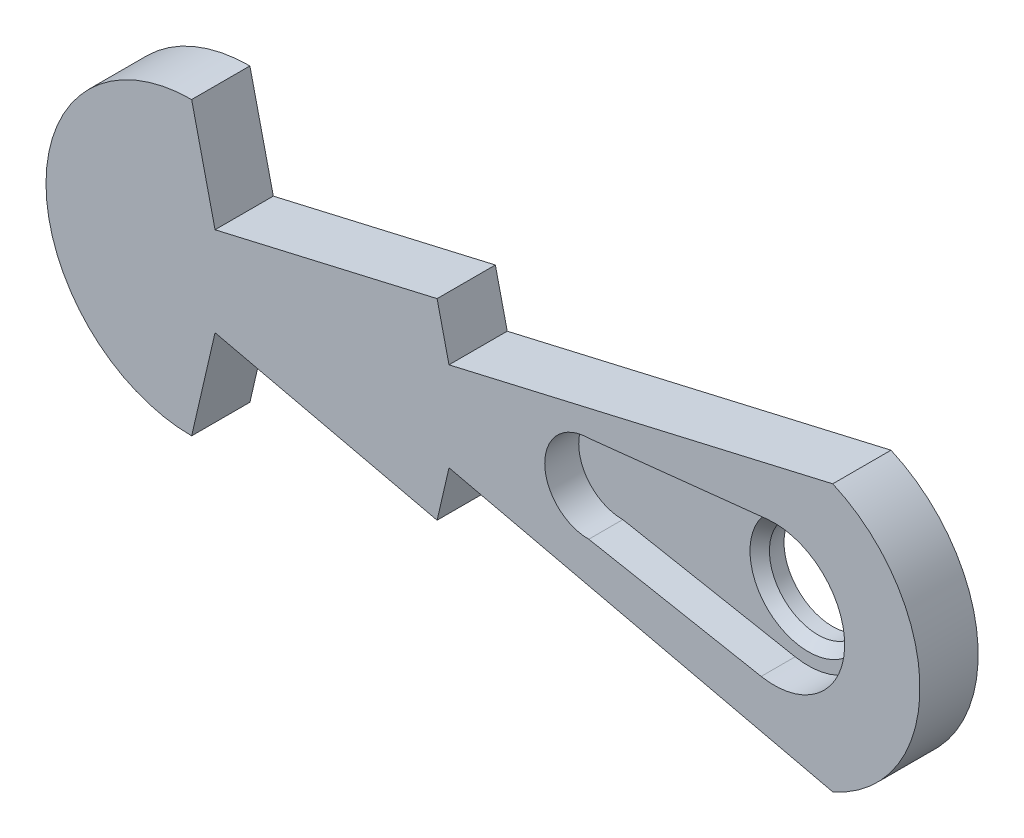
ISO-10303-21;
HEADER;
FILE_DESCRIPTION(('STEP AP214'),'2;1');
FILE_NAME('part.step','',(''),(''),'','','');
FILE_SCHEMA(('AUTOMOTIVE_DESIGN { 1 0 10303 214 1 1 1 1 }'));
ENDSEC;
DATA;
#1=APPLICATION_CONTEXT('core data for automotive mechanical design processes');
#2=APPLICATION_PROTOCOL_DEFINITION('international standard','automotive_design',2000,#1);
#3=PRODUCT_CONTEXT('',#1,'mechanical');
#4=PRODUCT('Part','Part','',(#3));
#5=PRODUCT_RELATED_PRODUCT_CATEGORY('part','',(#4));
#6=PRODUCT_DEFINITION_FORMATION('','',#4);
#7=PRODUCT_DEFINITION_CONTEXT('part definition',#1,'design');
#8=PRODUCT_DEFINITION('design','',#6,#7);
#9=PRODUCT_DEFINITION_SHAPE('','',#8);
#10=(LENGTH_UNIT() NAMED_UNIT(*) SI_UNIT(.MILLI.,.METRE.));
#11=(NAMED_UNIT(*) PLANE_ANGLE_UNIT() SI_UNIT($,.RADIAN.));
#12=(NAMED_UNIT(*) SI_UNIT($,.STERADIAN.) SOLID_ANGLE_UNIT());
#13=UNCERTAINTY_MEASURE_WITH_UNIT(LENGTH_MEASURE(1.E-05),#10,'distance_accuracy_value','');
#14=(GEOMETRIC_REPRESENTATION_CONTEXT(3) GLOBAL_UNCERTAINTY_ASSIGNED_CONTEXT((#13)) GLOBAL_UNIT_ASSIGNED_CONTEXT((#10,
#11,#12)) REPRESENTATION_CONTEXT('',''));
#15=CARTESIAN_POINT('',(0.,0.,0.));
#16=DIRECTION('',(0.,0.,1.));
#17=DIRECTION('',(1.,0.,0.));
#18=AXIS2_PLACEMENT_3D('',#15,#16,#17);
#19=CARTESIAN_POINT('',(24.346962962963,0.,0.));
#20=DIRECTION('',(0.,0.,1.));
#21=DIRECTION('',(1.,0.,0.));
#22=AXIS2_PLACEMENT_3D('',#19,#20,#21);
#23=CYLINDRICAL_SURFACE('',#22,5.);
#24=CARTESIAN_POINT('',(24.346962962963,0.,-0.500000000000015));
#25=DIRECTION('',(0.,0.,1.));
#26=DIRECTION('',(1.,0.,0.));
#27=AXIS2_PLACEMENT_3D('',#24,#25,#26);
#28=CIRCLE('',#27,5.);
#29=CARTESIAN_POINT('',(29.346962962963,0.,-0.500000000000015));
#30=VERTEX_POINT('',#29);
#31=EDGE_CURVE('E12',#30,#30,#28,.T.);
#32=ORIENTED_EDGE('',*,*,#31,.T.);
#33=EDGE_LOOP('',(#32));
#34=FACE_BOUND('',#33,.T.);
#35=CARTESIAN_POINT('',(24.346962962963,0.,-2.));
#36=DIRECTION('',(0.,0.,-1.));
#37=DIRECTION('',(-1.,0.,0.));
#38=AXIS2_PLACEMENT_3D('',#35,#36,#37);
#39=CIRCLE('',#38,5.);
#40=CARTESIAN_POINT('',(19.346962962963,0.,-2.));
#41=VERTEX_POINT('',#40);
#42=EDGE_CURVE('E566',#41,#41,#39,.T.);
#43=ORIENTED_EDGE('',*,*,#42,.T.);
#44=EDGE_LOOP('',(#43));
#45=FACE_BOUND('',#44,.T.);
#46=ADVANCED_FACE('F105',(#34,#45),#23,.F.);
#47=CARTESIAN_POINT('',(-35.653037037037,0.,4.));
#48=DIRECTION('',(0.,0.,1.));
#49=DIRECTION('',(1.,0.,0.));
#50=AXIS2_PLACEMENT_3D('',#47,#48,#49);
#51=PLANE('',#50);
#52=DIRECTION('',(-0.994296405562891,-0.106652041165249,0.));
#53=VECTOR('',#52,1.);
#54=CARTESIAN_POINT('',(-0.49628892421255,4.6268059014514,4.));
#55=LINE('',#54,#53);
#56=CARTESIAN_POINT('',(23.5737356645149,7.20864894033096,4.));
#57=VERTEX_POINT('',#56);
#58=CARTESIAN_POINT('',(5.1730344718707,5.23491924555615,4.));
#59=VERTEX_POINT('',#58);
#60=EDGE_CURVE('E120',#57,#59,#55,.T.);
#61=ORIENTED_EDGE('',*,*,#60,.F.);
#62=CARTESIAN_POINT('',(24.346962962963,0.,4.));
#63=DIRECTION('',(0.,0.,1.));
#64=DIRECTION('',(1.,0.,0.));
#65=AXIS2_PLACEMENT_3D('',#62,#63,#64);
#66=CIRCLE('',#65,7.25);
#67=CARTESIAN_POINT('',(22.9992121097158,-7.1236274213052,4.));
#68=VERTEX_POINT('',#67);
#69=EDGE_CURVE('E306',#68,#57,#66,.T.);
#70=ORIENTED_EDGE('',*,*,#69,.F.);
#71=DIRECTION('',(-0.982569299490373,0.185896669413408,0.));
#72=VECTOR('',#71,1.);
#73=CARTESIAN_POINT('',(-0.506378935001769,-2.6764997835162,4.));
#74=LINE('',#73,#72);
#75=CARTESIAN_POINT('',(5.24583251092057,-3.76478632993411,4.));
#76=VERTEX_POINT('',#75);
#77=EDGE_CURVE('E320',#68,#76,#74,.T.);
#78=ORIENTED_EDGE('',*,*,#77,.T.);
#79=CARTESIAN_POINT('',(5.20943349139563,0.735066457811019,4.));
#80=DIRECTION('',(0.,0.,1.));
#81=DIRECTION('',(1.,0.,0.));
#82=AXIS2_PLACEMENT_3D('',#79,#80,#81);
#83=CIRCLE('',#82,4.5);
#84=EDGE_CURVE('E317',#59,#76,#83,.T.);
#85=ORIENTED_EDGE('',*,*,#84,.F.);
#86=EDGE_LOOP('',(#61,#70,#78,#85));
#87=FACE_BOUND('',#86,.T.);
#88=CARTESIAN_POINT('',(-35.653037037037,0.,4.));
#89=DIRECTION('',(0.,0.,1.));
#90=DIRECTION('',(1.,0.,0.));
#91=AXIS2_PLACEMENT_3D('',#88,#89,#90);
#92=CIRCLE('',#91,15.);
#93=CARTESIAN_POINT('',(-35.653037037037,15.,4.));
#94=VERTEX_POINT('',#93);
#95=CARTESIAN_POINT('',(-35.653037037037,-15.,4.));
#96=VERTEX_POINT('',#95);
#97=EDGE_CURVE('E176',#94,#96,#92,.T.);
#98=ORIENTED_EDGE('',*,*,#97,.T.);
#99=DIRECTION('',(0.225493963672829,0.974244564956416,0.));
#100=VECTOR('',#99,1.);
#101=CARTESIAN_POINT('',(-30.544874222306,7.06976975394667,4.));
#102=LINE('',#101,#100);
#103=CARTESIAN_POINT('',(-33.2437545519344,-4.59071751489741,4.));
#104=VERTEX_POINT('',#103);
#105=EDGE_CURVE('E163',#96,#104,#102,.T.);
#106=ORIENTED_EDGE('',*,*,#105,.T.);
#107=DIRECTION('',(0.974244564956416,-0.225493963672829,0.));
#108=VECTOR('',#107,1.);
#109=CARTESIAN_POINT('',(-2.69888032962836,-11.6604872688441,4.));
#110=LINE('',#109,#108);
#111=CARTESIAN_POINT('',(-10.3759902787571,-9.88358030497655,4.));
#112=VERTEX_POINT('',#111);
#113=EDGE_CURVE('E175',#104,#112,#110,.T.);
#114=ORIENTED_EDGE('',*,*,#113,.T.);
#115=DIRECTION('',(0.225493963672828,0.974244564956417,0.));
#116=VECTOR('',#115,1.);
#117=CARTESIAN_POINT('',(-7.67710994912871,1.77690696386752,4.));
#118=LINE('',#117,#116);
#119=CARTESIAN_POINT('',(-9.15092970090846,-4.59071751489741,4.));
#120=VERTEX_POINT('',#119);
#121=EDGE_CURVE('E208',#112,#120,#118,.T.);
#122=ORIENTED_EDGE('',*,*,#121,.T.);
#123=DIRECTION('',(0.974244564956417,-0.225493963672828,0.));
#124=VECTOR('',#123,1.);
#125=CARTESIAN_POINT('',(-1.47381975177974,-6.36762447876493,4.));
#126=LINE('',#125,#124);
#127=CARTESIAN_POINT('',(30.3694147785392,-13.7379064682019,4.));
#128=VERTEX_POINT('',#127);
#129=EDGE_CURVE('E204',#120,#128,#126,.T.);
#130=ORIENTED_EDGE('',*,*,#129,.T.);
#131=CARTESIAN_POINT('',(24.346962962963,0.,4.));
#132=DIRECTION('',(0.,0.,1.));
#133=DIRECTION('',(1.,0.,0.));
#134=AXIS2_PLACEMENT_3D('',#131,#132,#133);
#135=CIRCLE('',#134,15.);
#136=CARTESIAN_POINT('',(30.3694147785392,13.7379064682019,4.));
#137=VERTEX_POINT('',#136);
#138=EDGE_CURVE('E207',#128,#137,#135,.T.);
#139=ORIENTED_EDGE('',*,*,#138,.T.);
#140=DIRECTION('',(0.974244564956417,0.225493963672828,0.));
#141=VECTOR('',#140,1.);
#142=CARTESIAN_POINT('',(-1.47381975177974,6.36762447876493,4.));
#143=LINE('',#142,#141);
#144=CARTESIAN_POINT('',(-9.15092970090846,4.59071751489741,4.));
#145=VERTEX_POINT('',#144);
#146=EDGE_CURVE('E337',#145,#137,#143,.T.);
#147=ORIENTED_EDGE('',*,*,#146,.F.);
#148=DIRECTION('',(0.225493963672828,-0.974244564956417,0.));
#149=VECTOR('',#148,1.);
#150=CARTESIAN_POINT('',(-7.67710994912871,-1.77690696386752,4.));
#151=LINE('',#150,#149);
#152=CARTESIAN_POINT('',(-10.3759902787571,9.88358030497655,4.));
#153=VERTEX_POINT('',#152);
#154=EDGE_CURVE('E334',#153,#145,#151,.T.);
#155=ORIENTED_EDGE('',*,*,#154,.F.);
#156=DIRECTION('',(0.974244564956416,0.225493963672829,0.));
#157=VECTOR('',#156,1.);
#158=CARTESIAN_POINT('',(-2.69888032962836,11.6604872688441,4.));
#159=LINE('',#158,#157);
#160=CARTESIAN_POINT('',(-33.2437545519344,4.59071751489741,4.));
#161=VERTEX_POINT('',#160);
#162=EDGE_CURVE('E347',#161,#153,#159,.T.);
#163=ORIENTED_EDGE('',*,*,#162,.F.);
#164=DIRECTION('',(0.225493963672829,-0.974244564956416,0.));
#165=VECTOR('',#164,1.);
#166=CARTESIAN_POINT('',(-30.544874222306,-7.06976975394667,4.));
#167=LINE('',#166,#165);
#168=EDGE_CURVE('E183',#94,#161,#167,.T.);
#169=ORIENTED_EDGE('',*,*,#168,.F.);
#170=EDGE_LOOP('',(#98,#106,#114,#122,#130,#139,#147,#155,#163,#169));
#171=FACE_BOUND('',#170,.T.);
#172=ADVANCED_FACE('F180',(#87,#171),#51,.T.);
#173=CARTESIAN_POINT('',(24.346962962963,0.,4.));
#174=DIRECTION('',(0.,0.,-1.));
#175=DIRECTION('',(-1.,0.,0.));
#176=AXIS2_PLACEMENT_3D('',#173,#174,#175);
#177=CYLINDRICAL_SURFACE('',#176,15.);
#178=DIRECTION('',(0.,0.,1.));
#179=VECTOR('',#178,1.);
#180=CARTESIAN_POINT('',(30.3694147785392,-13.7379064682019,0.));
#181=LINE('',#180,#179);
#182=CARTESIAN_POINT('',(30.3694147785392,-13.7379064682019,-2.));
#183=VERTEX_POINT('',#182);
#184=EDGE_CURVE('E192',#183,#128,#181,.T.);
#185=ORIENTED_EDGE('',*,*,#184,.F.);
#186=CARTESIAN_POINT('',(24.346962962963,0.,-2.));
#187=DIRECTION('',(0.,0.,-1.));
#188=DIRECTION('',(-1.,0.,0.));
#189=AXIS2_PLACEMENT_3D('',#186,#187,#188);
#190=CIRCLE('',#189,15.);
#191=CARTESIAN_POINT('',(30.3694147785392,13.7379064682019,-2.));
#192=VERTEX_POINT('',#191);
#193=EDGE_CURVE('E295',#192,#183,#190,.T.);
#194=ORIENTED_EDGE('',*,*,#193,.F.);
#195=DIRECTION('',(0.,0.,1.));
#196=VECTOR('',#195,1.);
#197=CARTESIAN_POINT('',(30.3694147785392,13.7379064682019,0.));
#198=LINE('',#197,#196);
#199=EDGE_CURVE('E338',#192,#137,#198,.T.);
#200=ORIENTED_EDGE('',*,*,#199,.T.);
#201=ORIENTED_EDGE('',*,*,#138,.F.);
#202=EDGE_LOOP('',(#185,#194,#200,#201));
#203=FACE_BOUND('',#202,.T.);
#204=ADVANCED_FACE('F233',(#203),#177,.T.);
#205=CARTESIAN_POINT('',(-35.653037037037,0.,4.));
#206=DIRECTION('',(0.,0.,-1.));
#207=DIRECTION('',(-1.,0.,0.));
#208=AXIS2_PLACEMENT_3D('',#205,#206,#207);
#209=CYLINDRICAL_SURFACE('',#208,15.);
#210=DIRECTION('',(0.,0.,-1.));
#211=VECTOR('',#210,1.);
#212=CARTESIAN_POINT('',(-35.653037037037,15.,4.));
#213=LINE('',#212,#211);
#214=CARTESIAN_POINT('',(-35.653037037037,15.,-2.));
#215=VERTEX_POINT('',#214);
#216=EDGE_CURVE('E198',#94,#215,#213,.T.);
#217=ORIENTED_EDGE('',*,*,#216,.T.);
#218=CARTESIAN_POINT('',(-35.653037037037,0.,-2.));
#219=DIRECTION('',(0.,0.,-1.));
#220=DIRECTION('',(-1.,0.,0.));
#221=AXIS2_PLACEMENT_3D('',#218,#219,#220);
#222=CIRCLE('',#221,15.);
#223=CARTESIAN_POINT('',(-35.653037037037,-15.,-2.));
#224=VERTEX_POINT('',#223);
#225=EDGE_CURVE('E191',#224,#215,#222,.T.);
#226=ORIENTED_EDGE('',*,*,#225,.F.);
#227=DIRECTION('',(0.,0.,-1.));
#228=VECTOR('',#227,1.);
#229=CARTESIAN_POINT('',(-35.653037037037,-15.,4.));
#230=LINE('',#229,#228);
#231=EDGE_CURVE('E169',#96,#224,#230,.T.);
#232=ORIENTED_EDGE('',*,*,#231,.F.);
#233=ORIENTED_EDGE('',*,*,#97,.F.);
#234=EDGE_LOOP('',(#217,#226,#232,#233));
#235=FACE_BOUND('',#234,.T.);
#236=ADVANCED_FACE('F189',(#235),#209,.T.);
#237=CARTESIAN_POINT('',(-2.69888032962836,11.6604872688441,0.));
#238=DIRECTION('',(0.225493963672829,-0.974244564956416,0.));
#239=DIRECTION('',(0.974244564956416,0.225493963672829,0.));
#240=AXIS2_PLACEMENT_3D('',#237,#238,#239);
#241=PLANE('',#240);
#242=ORIENTED_EDGE('',*,*,#162,.T.);
#243=DIRECTION('',(0.,0.,1.));
#244=VECTOR('',#243,1.);
#245=CARTESIAN_POINT('',(-10.3759902787571,9.88358030497655,0.));
#246=LINE('',#245,#244);
#247=CARTESIAN_POINT('',(-10.3759902787571,9.88358030497655,-2.));
#248=VERTEX_POINT('',#247);
#249=EDGE_CURVE('E203',#248,#153,#246,.T.);
#250=ORIENTED_EDGE('',*,*,#249,.F.);
#251=DIRECTION('',(0.974244564956416,0.225493963672829,0.));
#252=VECTOR('',#251,1.);
#253=CARTESIAN_POINT('',(-33.2437545519344,4.59071751489741,-2.));
#254=LINE('',#253,#252);
#255=CARTESIAN_POINT('',(-33.2437545519344,4.59071751489741,-2.));
#256=VERTEX_POINT('',#255);
#257=EDGE_CURVE('E555',#256,#248,#254,.T.);
#258=ORIENTED_EDGE('',*,*,#257,.F.);
#259=DIRECTION('',(0.,0.,1.));
#260=VECTOR('',#259,1.);
#261=CARTESIAN_POINT('',(-33.2437545519344,4.59071751489741,0.));
#262=LINE('',#261,#260);
#263=EDGE_CURVE('E346',#256,#161,#262,.T.);
#264=ORIENTED_EDGE('',*,*,#263,.T.);
#265=EDGE_LOOP('',(#242,#250,#258,#264));
#266=FACE_BOUND('',#265,.T.);
#267=ADVANCED_FACE('F250',(#266),#241,.F.);
#268=CARTESIAN_POINT('',(-30.544874222306,-7.06976975394667,0.));
#269=DIRECTION('',(-0.974244564956416,-0.225493963672829,0.));
#270=DIRECTION('',(0.225493963672829,-0.974244564956416,0.));
#271=AXIS2_PLACEMENT_3D('',#268,#269,#270);
#272=PLANE('',#271);
#273=ORIENTED_EDGE('',*,*,#168,.T.);
#274=ORIENTED_EDGE('',*,*,#263,.F.);
#275=DIRECTION('',(0.225493963672829,-0.974244564956416,0.));
#276=VECTOR('',#275,1.);
#277=CARTESIAN_POINT('',(-35.653037037037,15.,-2.));
#278=LINE('',#277,#276);
#279=EDGE_CURVE('E551',#215,#256,#278,.T.);
#280=ORIENTED_EDGE('',*,*,#279,.F.);
#281=ORIENTED_EDGE('',*,*,#216,.F.);
#282=EDGE_LOOP('',(#273,#274,#280,#281));
#283=FACE_BOUND('',#282,.T.);
#284=ADVANCED_FACE('F248',(#283),#272,.F.);
#285=CARTESIAN_POINT('',(-1.47381975177974,6.36762447876493,0.));
#286=DIRECTION('',(0.225493963672828,-0.974244564956416,0.));
#287=DIRECTION('',(0.974244564956417,0.225493963672828,0.));
#288=AXIS2_PLACEMENT_3D('',#285,#286,#287);
#289=PLANE('',#288);
#290=ORIENTED_EDGE('',*,*,#146,.T.);
#291=ORIENTED_EDGE('',*,*,#199,.F.);
#292=DIRECTION('',(0.974244564956416,0.225493963672828,0.));
#293=VECTOR('',#292,1.);
#294=CARTESIAN_POINT('',(-9.15092970090846,4.59071751489741,-2.));
#295=LINE('',#294,#293);
#296=CARTESIAN_POINT('',(-9.15092970090846,4.59071751489741,-2.));
#297=VERTEX_POINT('',#296);
#298=EDGE_CURVE('E298',#297,#192,#295,.T.);
#299=ORIENTED_EDGE('',*,*,#298,.F.);
#300=DIRECTION('',(0.,0.,1.));
#301=VECTOR('',#300,1.);
#302=CARTESIAN_POINT('',(-9.15092970090846,4.59071751489741,0.));
#303=LINE('',#302,#301);
#304=EDGE_CURVE('E335',#297,#145,#303,.T.);
#305=ORIENTED_EDGE('',*,*,#304,.T.);
#306=EDGE_LOOP('',(#290,#291,#299,#305));
#307=FACE_BOUND('',#306,.T.);
#308=ADVANCED_FACE('F244',(#307),#289,.F.);
#309=CARTESIAN_POINT('',(-7.67710994912871,-1.77690696386752,0.));
#310=DIRECTION('',(-0.974244564956417,-0.225493963672828,0.));
#311=DIRECTION('',(0.225493963672828,-0.974244564956417,0.));
#312=AXIS2_PLACEMENT_3D('',#309,#310,#311);
#313=PLANE('',#312);
#314=ORIENTED_EDGE('',*,*,#154,.T.);
#315=ORIENTED_EDGE('',*,*,#304,.F.);
#316=DIRECTION('',(0.225493963672828,-0.974244564956417,0.));
#317=VECTOR('',#316,1.);
#318=CARTESIAN_POINT('',(-10.3759902787571,9.88358030497655,-2.));
#319=LINE('',#318,#317);
#320=EDGE_CURVE('E557',#248,#297,#319,.T.);
#321=ORIENTED_EDGE('',*,*,#320,.F.);
#322=ORIENTED_EDGE('',*,*,#249,.T.);
#323=EDGE_LOOP('',(#314,#315,#321,#322));
#324=FACE_BOUND('',#323,.T.);
#325=ADVANCED_FACE('F240',(#324),#313,.F.);
#326=CARTESIAN_POINT('',(-7.67710994912871,1.77690696386752,0.));
#327=DIRECTION('',(0.974244564956417,-0.225493963672828,0.));
#328=DIRECTION('',(0.225493963672828,0.974244564956417,0.));
#329=AXIS2_PLACEMENT_3D('',#326,#327,#328);
#330=PLANE('',#329);
#331=ORIENTED_EDGE('',*,*,#121,.F.);
#332=DIRECTION('',(0.,0.,1.));
#333=VECTOR('',#332,1.);
#334=CARTESIAN_POINT('',(-10.3759902787571,-9.88358030497655,0.));
#335=LINE('',#334,#333);
#336=CARTESIAN_POINT('',(-10.3759902787571,-9.88358030497655,-2.));
#337=VERTEX_POINT('',#336);
#338=EDGE_CURVE('E129',#337,#112,#335,.T.);
#339=ORIENTED_EDGE('',*,*,#338,.F.);
#340=DIRECTION('',(-0.225493963672828,-0.974244564956417,0.));
#341=VECTOR('',#340,1.);
#342=CARTESIAN_POINT('',(-9.15092970090846,-4.59071751489741,-2.));
#343=LINE('',#342,#341);
#344=CARTESIAN_POINT('',(-9.15092970090846,-4.59071751489741,-2.));
#345=VERTEX_POINT('',#344);
#346=EDGE_CURVE('E284',#345,#337,#343,.T.);
#347=ORIENTED_EDGE('',*,*,#346,.F.);
#348=DIRECTION('',(0.,0.,1.));
#349=VECTOR('',#348,1.);
#350=CARTESIAN_POINT('',(-9.15092970090846,-4.59071751489741,0.));
#351=LINE('',#350,#349);
#352=EDGE_CURVE('E195',#345,#120,#351,.T.);
#353=ORIENTED_EDGE('',*,*,#352,.T.);
#354=EDGE_LOOP('',(#331,#339,#347,#353));
#355=FACE_BOUND('',#354,.T.);
#356=ADVANCED_FACE('F243',(#355),#330,.T.);
#357=CARTESIAN_POINT('',(-1.47381975177974,-6.36762447876493,0.));
#358=DIRECTION('',(-0.225493963672828,-0.974244564956416,0.));
#359=DIRECTION('',(0.974244564956417,-0.225493963672828,0.));
#360=AXIS2_PLACEMENT_3D('',#357,#358,#359);
#361=PLANE('',#360);
#362=ORIENTED_EDGE('',*,*,#129,.F.);
#363=ORIENTED_EDGE('',*,*,#352,.F.);
#364=DIRECTION('',(-0.974244564956417,0.225493963672828,0.));
#365=VECTOR('',#364,1.);
#366=CARTESIAN_POINT('',(30.3694147785392,-13.7379064682019,-2.));
#367=LINE('',#366,#365);
#368=EDGE_CURVE('E288',#183,#345,#367,.T.);
#369=ORIENTED_EDGE('',*,*,#368,.F.);
#370=ORIENTED_EDGE('',*,*,#184,.T.);
#371=EDGE_LOOP('',(#362,#363,#369,#370));
#372=FACE_BOUND('',#371,.T.);
#373=ADVANCED_FACE('F264',(#372),#361,.T.);
#374=CARTESIAN_POINT('',(-30.544874222306,7.06976975394667,0.));
#375=DIRECTION('',(0.974244564956416,-0.225493963672829,0.));
#376=DIRECTION('',(0.225493963672829,0.974244564956416,0.));
#377=AXIS2_PLACEMENT_3D('',#374,#375,#376);
#378=PLANE('',#377);
#379=ORIENTED_EDGE('',*,*,#105,.F.);
#380=ORIENTED_EDGE('',*,*,#231,.T.);
#381=DIRECTION('',(-0.225493963672829,-0.974244564956416,0.));
#382=VECTOR('',#381,1.);
#383=CARTESIAN_POINT('',(-33.2437545519344,-4.59071751489741,-2.));
#384=LINE('',#383,#382);
#385=CARTESIAN_POINT('',(-33.2437545519344,-4.59071751489741,-2.));
#386=VERTEX_POINT('',#385);
#387=EDGE_CURVE('E553',#386,#224,#384,.T.);
#388=ORIENTED_EDGE('',*,*,#387,.F.);
#389=DIRECTION('',(0.,0.,1.));
#390=VECTOR('',#389,1.);
#391=CARTESIAN_POINT('',(-33.2437545519344,-4.59071751489741,0.));
#392=LINE('',#391,#390);
#393=EDGE_CURVE('E172',#386,#104,#392,.T.);
#394=ORIENTED_EDGE('',*,*,#393,.T.);
#395=EDGE_LOOP('',(#379,#380,#388,#394));
#396=FACE_BOUND('',#395,.T.);
#397=ADVANCED_FACE('F165',(#396),#378,.T.);
#398=CARTESIAN_POINT('',(-2.69888032962836,-11.6604872688441,0.));
#399=DIRECTION('',(-0.225493963672829,-0.974244564956416,0.));
#400=DIRECTION('',(0.974244564956416,-0.225493963672829,0.));
#401=AXIS2_PLACEMENT_3D('',#398,#399,#400);
#402=PLANE('',#401);
#403=ORIENTED_EDGE('',*,*,#113,.F.);
#404=ORIENTED_EDGE('',*,*,#393,.F.);
#405=DIRECTION('',(-0.974244564956416,0.225493963672829,0.));
#406=VECTOR('',#405,1.);
#407=CARTESIAN_POINT('',(-10.3759902787571,-9.88358030497655,-2.));
#408=LINE('',#407,#406);
#409=EDGE_CURVE('E564',#337,#386,#408,.T.);
#410=ORIENTED_EDGE('',*,*,#409,.F.);
#411=ORIENTED_EDGE('',*,*,#338,.T.);
#412=EDGE_LOOP('',(#403,#404,#410,#411));
#413=FACE_BOUND('',#412,.T.);
#414=ADVANCED_FACE('F271',(#413),#402,.T.);
#415=CARTESIAN_POINT('',(-0.49628892421255,4.6268059014514,0.5));
#416=DIRECTION('',(-0.106652041165249,0.994296405562891,0.));
#417=DIRECTION('',(-0.994296405562891,-0.106652041165249,0.));
#418=AXIS2_PLACEMENT_3D('',#415,#416,#417);
#419=PLANE('',#418);
#420=ORIENTED_EDGE('',*,*,#60,.T.);
#421=DIRECTION('',(0.,0.,1.));
#422=VECTOR('',#421,1.);
#423=CARTESIAN_POINT('',(5.1730344718707,5.23491924555615,0.5));
#424=LINE('',#423,#422);
#425=CARTESIAN_POINT('',(5.1730344718707,5.23491924555615,0.5));
#426=VERTEX_POINT('',#425);
#427=EDGE_CURVE('E315',#426,#59,#424,.T.);
#428=ORIENTED_EDGE('',*,*,#427,.F.);
#429=DIRECTION('',(-0.994296405562891,-0.106652041165249,0.));
#430=VECTOR('',#429,1.);
#431=CARTESIAN_POINT('',(-0.49628892421255,4.6268059014514,0.5));
#432=LINE('',#431,#430);
#433=CARTESIAN_POINT('',(23.5737356645149,7.20864894033096,0.5));
#434=VERTEX_POINT('',#433);
#435=EDGE_CURVE('E302',#434,#426,#432,.T.);
#436=ORIENTED_EDGE('',*,*,#435,.F.);
#437=DIRECTION('',(0.,0.,1.));
#438=VECTOR('',#437,1.);
#439=CARTESIAN_POINT('',(23.5737356645149,7.20864894033096,0.5));
#440=LINE('',#439,#438);
#441=EDGE_CURVE('E186',#434,#57,#440,.T.);
#442=ORIENTED_EDGE('',*,*,#441,.T.);
#443=EDGE_LOOP('',(#420,#428,#436,#442));
#444=FACE_BOUND('',#443,.T.);
#445=ADVANCED_FACE('F238',(#444),#419,.F.);
#446=CARTESIAN_POINT('',(24.346962962963,0.,0.5));
#447=DIRECTION('',(0.,0.,1.));
#448=DIRECTION('',(1.,0.,0.));
#449=AXIS2_PLACEMENT_3D('',#446,#447,#448);
#450=CYLINDRICAL_SURFACE('',#449,7.25);
#451=ORIENTED_EDGE('',*,*,#69,.T.);
#452=ORIENTED_EDGE('',*,*,#441,.F.);
#453=CARTESIAN_POINT('',(24.346962962963,0.,0.5));
#454=DIRECTION('',(0.,0.,1.));
#455=DIRECTION('',(1.,0.,0.));
#456=AXIS2_PLACEMENT_3D('',#453,#454,#455);
#457=CIRCLE('',#456,7.25);
#458=CARTESIAN_POINT('',(22.9992121097158,-7.1236274213052,0.5));
#459=VERTEX_POINT('',#458);
#460=EDGE_CURVE('E312',#459,#434,#457,.T.);
#461=ORIENTED_EDGE('',*,*,#460,.F.);
#462=DIRECTION('',(0.,0.,1.));
#463=VECTOR('',#462,1.);
#464=CARTESIAN_POINT('',(22.9992121097158,-7.1236274213052,0.5));
#465=LINE('',#464,#463);
#466=EDGE_CURVE('E326',#459,#68,#465,.T.);
#467=ORIENTED_EDGE('',*,*,#466,.T.);
#468=EDGE_LOOP('',(#451,#452,#461,#467));
#469=FACE_BOUND('',#468,.T.);
#470=ADVANCED_FACE('F276',(#469),#450,.F.);
#471=CARTESIAN_POINT('',(-0.506378935001769,-2.6764997835162,0.5));
#472=DIRECTION('',(0.185896669413408,0.982569299490373,0.));
#473=DIRECTION('',(-0.982569299490373,0.185896669413408,0.));
#474=AXIS2_PLACEMENT_3D('',#471,#472,#473);
#475=PLANE('',#474);
#476=ORIENTED_EDGE('',*,*,#77,.F.);
#477=ORIENTED_EDGE('',*,*,#466,.F.);
#478=DIRECTION('',(-0.982569299490373,0.185896669413408,0.));
#479=VECTOR('',#478,1.);
#480=CARTESIAN_POINT('',(-0.506378935001769,-2.6764997835162,0.5));
#481=LINE('',#480,#479);
#482=CARTESIAN_POINT('',(5.24583251092057,-3.76478632993411,0.5));
#483=VERTEX_POINT('',#482);
#484=EDGE_CURVE('E309',#459,#483,#481,.T.);
#485=ORIENTED_EDGE('',*,*,#484,.T.);
#486=DIRECTION('',(0.,0.,1.));
#487=VECTOR('',#486,1.);
#488=CARTESIAN_POINT('',(5.24583251092057,-3.76478632993411,0.5));
#489=LINE('',#488,#487);
#490=EDGE_CURVE('E329',#483,#76,#489,.T.);
#491=ORIENTED_EDGE('',*,*,#490,.T.);
#492=EDGE_LOOP('',(#476,#477,#485,#491));
#493=FACE_BOUND('',#492,.T.);
#494=ADVANCED_FACE('F388',(#493),#475,.T.);
#495=CARTESIAN_POINT('',(5.20943349139563,0.735066457811019,0.5));
#496=DIRECTION('',(0.,0.,1.));
#497=DIRECTION('',(1.,0.,0.));
#498=AXIS2_PLACEMENT_3D('',#495,#496,#497);
#499=CYLINDRICAL_SURFACE('',#498,4.5);
#500=ORIENTED_EDGE('',*,*,#84,.T.);
#501=ORIENTED_EDGE('',*,*,#490,.F.);
#502=CARTESIAN_POINT('',(5.20943349139563,0.735066457811019,0.5));
#503=DIRECTION('',(0.,0.,1.));
#504=DIRECTION('',(1.,0.,0.));
#505=AXIS2_PLACEMENT_3D('',#502,#503,#504);
#506=CIRCLE('',#505,4.5);
#507=EDGE_CURVE('E305',#426,#483,#506,.T.);
#508=ORIENTED_EDGE('',*,*,#507,.F.);
#509=ORIENTED_EDGE('',*,*,#427,.T.);
#510=EDGE_LOOP('',(#500,#501,#508,#509));
#511=FACE_BOUND('',#510,.T.);
#512=ADVANCED_FACE('F384',(#511),#499,.F.);
#513=CARTESIAN_POINT('',(0.,0.,0.5));
#514=DIRECTION('',(0.,0.,1.));
#515=DIRECTION('',(1.,0.,0.));
#516=AXIS2_PLACEMENT_3D('',#513,#514,#515);
#517=PLANE('',#516);
#518=CARTESIAN_POINT('',(24.346962962963,0.,0.5));
#519=DIRECTION('',(0.,0.,1.));
#520=DIRECTION('',(1.,0.,0.));
#521=AXIS2_PLACEMENT_3D('',#518,#519,#520);
#522=CIRCLE('',#521,6.00000000000001);
#523=CARTESIAN_POINT('',(30.346962962963,0.,0.5));
#524=VERTEX_POINT('',#523);
#525=EDGE_CURVE('E113',#524,#524,#522,.F.);
#526=ORIENTED_EDGE('',*,*,#525,.T.);
#527=EDGE_LOOP('',(#526));
#528=FACE_BOUND('',#527,.T.);
#529=ORIENTED_EDGE('',*,*,#435,.T.);
#530=ORIENTED_EDGE('',*,*,#507,.T.);
#531=ORIENTED_EDGE('',*,*,#484,.F.);
#532=ORIENTED_EDGE('',*,*,#460,.T.);
#533=EDGE_LOOP('',(#529,#530,#531,#532));
#534=FACE_BOUND('',#533,.T.);
#535=ADVANCED_FACE('F215',(#528,#534),#517,.T.);
#536=CARTESIAN_POINT('',(-35.653037037037,0.,-2.));
#537=DIRECTION('',(0.,0.,-1.));
#538=DIRECTION('',(-1.,0.,0.));
#539=AXIS2_PLACEMENT_3D('',#536,#537,#538);
#540=PLANE('',#539);
#541=ORIENTED_EDGE('',*,*,#409,.T.);
#542=ORIENTED_EDGE('',*,*,#387,.T.);
#543=ORIENTED_EDGE('',*,*,#225,.T.);
#544=ORIENTED_EDGE('',*,*,#279,.T.);
#545=ORIENTED_EDGE('',*,*,#257,.T.);
#546=ORIENTED_EDGE('',*,*,#320,.T.);
#547=ORIENTED_EDGE('',*,*,#298,.T.);
#548=ORIENTED_EDGE('',*,*,#193,.T.);
#549=ORIENTED_EDGE('',*,*,#368,.T.);
#550=ORIENTED_EDGE('',*,*,#346,.T.);
#551=EDGE_LOOP('',(#541,#542,#543,#544,#545,#546,#547,#548,#549,#550));
#552=FACE_BOUND('',#551,.T.);
#553=ORIENTED_EDGE('',*,*,#42,.F.);
#554=EDGE_LOOP('',(#553));
#555=FACE_BOUND('',#554,.T.);
#556=ADVANCED_FACE('F219',(#552,#555),#540,.T.);
#557=CARTESIAN_POINT('',(24.346962962963,0.,0.5));
#558=DIRECTION('',(0.,0.,1.));
#559=DIRECTION('',(1.,0.,0.));
#560=AXIS2_PLACEMENT_3D('',#557,#558,#559);
#561=CONICAL_SURFACE('',#560,6.00000000000001,0.785398163397447);
#562=ORIENTED_EDGE('',*,*,#31,.F.);
#563=EDGE_LOOP('',(#562));
#564=FACE_BOUND('',#563,.T.);
#565=ORIENTED_EDGE('',*,*,#525,.F.);
#566=EDGE_LOOP('',(#565));
#567=FACE_BOUND('',#566,.T.);
#568=ADVANCED_FACE('F107',(#564,#567),#561,.F.);
#569=CLOSED_SHELL('',(#46,#172,#204,#236,#267,#284,#308,#325,#356,#373,#397,#414,#445,#470,#494,
#512,#535,#556,#568));
#570=MANIFOLD_SOLID_BREP('B2',#569);
#571=ADVANCED_BREP_SHAPE_REPRESENTATION('',(#18,#570),#14);
#572=SHAPE_DEFINITION_REPRESENTATION(#9,#571);
ENDSEC;
END-ISO-10303-21;
